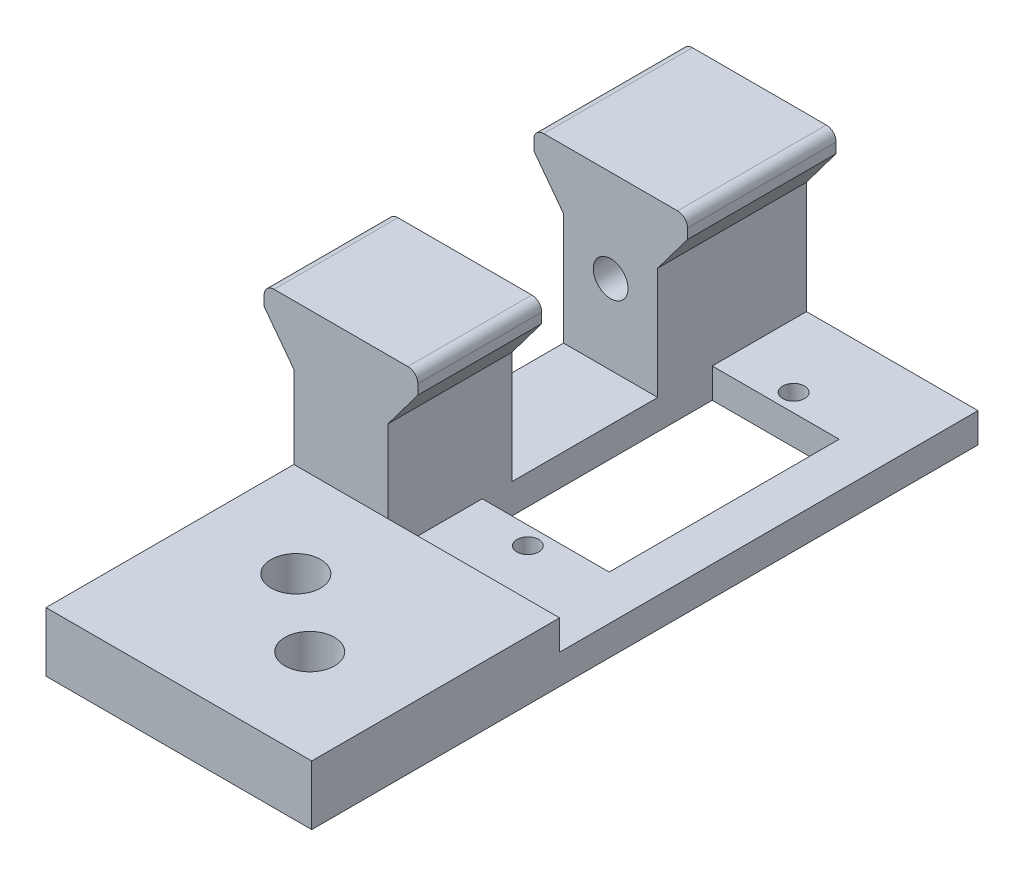
ISO-10303-21;
HEADER;
FILE_DESCRIPTION(('STEP AP214'),'2;1');
FILE_NAME('part.step','',(''),(''),'','','');
FILE_SCHEMA(('AUTOMOTIVE_DESIGN { 1 0 10303 214 1 1 1 1 }'));
ENDSEC;
DATA;
#1=APPLICATION_CONTEXT('core data for automotive mechanical design processes');
#2=APPLICATION_PROTOCOL_DEFINITION('international standard','automotive_design',2000,#1);
#3=PRODUCT_CONTEXT('',#1,'mechanical');
#4=PRODUCT('Part','Part','',(#3));
#5=PRODUCT_RELATED_PRODUCT_CATEGORY('part','',(#4));
#6=PRODUCT_DEFINITION_FORMATION('','',#4);
#7=PRODUCT_DEFINITION_CONTEXT('part definition',#1,'design');
#8=PRODUCT_DEFINITION('design','',#6,#7);
#9=PRODUCT_DEFINITION_SHAPE('','',#8);
#10=(LENGTH_UNIT() NAMED_UNIT(*) SI_UNIT(.MILLI.,.METRE.));
#11=(NAMED_UNIT(*) PLANE_ANGLE_UNIT() SI_UNIT($,.RADIAN.));
#12=(NAMED_UNIT(*) SI_UNIT($,.STERADIAN.) SOLID_ANGLE_UNIT());
#13=UNCERTAINTY_MEASURE_WITH_UNIT(LENGTH_MEASURE(1.E-05),#10,'distance_accuracy_value','');
#14=(GEOMETRIC_REPRESENTATION_CONTEXT(3) GLOBAL_UNCERTAINTY_ASSIGNED_CONTEXT((#13)) GLOBAL_UNIT_ASSIGNED_CONTEXT((#10,
#11,#12)) REPRESENTATION_CONTEXT('',''));
#15=CARTESIAN_POINT('',(0.,0.,0.));
#16=DIRECTION('',(0.,0.,1.));
#17=DIRECTION('',(1.,0.,0.));
#18=AXIS2_PLACEMENT_3D('',#15,#16,#17);
#19=CARTESIAN_POINT('',(-10.,3.,32.2));
#20=DIRECTION('',(0.,0.,-1.));
#21=DIRECTION('',(-1.,0.,0.));
#22=AXIS2_PLACEMENT_3D('',#19,#20,#21);
#23=PLANE('',#22);
#24=DIRECTION('',(-1.,0.,0.));
#25=VECTOR('',#24,1.);
#26=CARTESIAN_POINT('',(-10.,6.,32.2));
#27=LINE('',#26,#25);
#28=CARTESIAN_POINT('',(-0.500000000000092,6.,32.2));
#29=VERTEX_POINT('',#28);
#30=CARTESIAN_POINT('',(-10.,6.,32.2));
#31=VERTEX_POINT('',#30);
#32=EDGE_CURVE('E11',#29,#31,#27,.T.);
#33=ORIENTED_EDGE('',*,*,#32,.F.);
#34=DIRECTION('',(0.,-1.,0.));
#35=VECTOR('',#34,1.);
#36=CARTESIAN_POINT('',(-0.500000000000092,20.3,32.2));
#37=LINE('',#36,#35);
#38=CARTESIAN_POINT('',(-0.500000000000091,14.3,32.2));
#39=VERTEX_POINT('',#38);
#40=EDGE_CURVE('E360',#39,#29,#37,.T.);
#41=ORIENTED_EDGE('',*,*,#40,.F.);
#42=DIRECTION('',(0.6,0.8,0.));
#43=VECTOR('',#42,1.);
#44=CARTESIAN_POINT('',(2.49999999999991,18.3,32.2));
#45=LINE('',#44,#43);
#46=CARTESIAN_POINT('',(2.49999999999991,18.3,32.2));
#47=VERTEX_POINT('',#46);
#48=EDGE_CURVE('E300',#39,#47,#45,.T.);
#49=ORIENTED_EDGE('',*,*,#48,.T.);
#50=DIRECTION('',(0.,1.,0.));
#51=VECTOR('',#50,1.);
#52=CARTESIAN_POINT('',(2.49999999999991,20.3,32.2));
#53=LINE('',#52,#51);
#54=CARTESIAN_POINT('',(2.49999999999991,19.3,32.2));
#55=VERTEX_POINT('',#54);
#56=EDGE_CURVE('E311',#47,#55,#53,.T.);
#57=ORIENTED_EDGE('',*,*,#56,.T.);
#58=CARTESIAN_POINT('',(1.49999999999991,19.3,32.2));
#59=DIRECTION('',(0.,0.,-1.));
#60=DIRECTION('',(-1.,0.,0.));
#61=AXIS2_PLACEMENT_3D('',#58,#59,#60);
#62=CIRCLE('',#61,1.);
#63=CARTESIAN_POINT('',(1.49999999999991,20.3,32.2));
#64=VERTEX_POINT('',#63);
#65=EDGE_CURVE('E435',#55,#64,#62,.F.);
#66=ORIENTED_EDGE('',*,*,#65,.T.);
#67=DIRECTION('',(1.,0.,0.));
#68=VECTOR('',#67,1.);
#69=CARTESIAN_POINT('',(-10.,20.3,32.2));
#70=LINE('',#69,#68);
#71=CARTESIAN_POINT('',(-12.,20.3,32.2));
#72=VERTEX_POINT('',#71);
#73=EDGE_CURVE('E345',#72,#64,#70,.T.);
#74=ORIENTED_EDGE('',*,*,#73,.F.);
#75=CARTESIAN_POINT('',(-12.,19.3,32.2));
#76=DIRECTION('',(0.,0.,-1.));
#77=DIRECTION('',(-1.,0.,0.));
#78=AXIS2_PLACEMENT_3D('',#75,#76,#77);
#79=CIRCLE('',#78,1.);
#80=CARTESIAN_POINT('',(-13.,19.3,32.2));
#81=VERTEX_POINT('',#80);
#82=EDGE_CURVE('E437',#72,#81,#79,.F.);
#83=ORIENTED_EDGE('',*,*,#82,.T.);
#84=DIRECTION('',(0.,-1.,0.));
#85=VECTOR('',#84,1.);
#86=CARTESIAN_POINT('',(-13.,20.3,32.2));
#87=LINE('',#86,#85);
#88=CARTESIAN_POINT('',(-13.,18.3,32.2));
#89=VERTEX_POINT('',#88);
#90=EDGE_CURVE('E298',#81,#89,#87,.T.);
#91=ORIENTED_EDGE('',*,*,#90,.T.);
#92=DIRECTION('',(0.600000000000001,-0.8,0.));
#93=VECTOR('',#92,1.);
#94=CARTESIAN_POINT('',(-13.,18.3,32.2));
#95=LINE('',#94,#93);
#96=CARTESIAN_POINT('',(-10.,14.3,32.2));
#97=VERTEX_POINT('',#96);
#98=EDGE_CURVE('E289',#89,#97,#95,.T.);
#99=ORIENTED_EDGE('',*,*,#98,.T.);
#100=DIRECTION('',(0.,-1.,0.));
#101=VECTOR('',#100,1.);
#102=CARTESIAN_POINT('',(-10.,3.,32.2));
#103=LINE('',#102,#101);
#104=EDGE_CURVE('E423',#97,#31,#103,.T.);
#105=ORIENTED_EDGE('',*,*,#104,.T.);
#106=EDGE_LOOP('',(#33,#41,#49,#57,#66,#74,#83,#91,#99,#105));
#107=FACE_BOUND('',#106,.T.);
#108=ADVANCED_FACE('F39',(#107),#23,.F.);
#109=CARTESIAN_POINT('',(0.,20.3,0.));
#110=DIRECTION('',(0.,-1.,0.));
#111=DIRECTION('',(0.,0.,-1.));
#112=AXIS2_PLACEMENT_3D('',#109,#110,#111);
#113=PLANE('',#112);
#114=DIRECTION('',(-1.,0.,0.));
#115=VECTOR('',#114,1.);
#116=CARTESIAN_POINT('',(-10.,20.3,19.7));
#117=LINE('',#116,#115);
#118=CARTESIAN_POINT('',(1.49999999999991,20.3,19.7));
#119=VERTEX_POINT('',#118);
#120=CARTESIAN_POINT('',(-12.,20.3,19.7));
#121=VERTEX_POINT('',#120);
#122=EDGE_CURVE('E348',#119,#121,#117,.T.);
#123=ORIENTED_EDGE('',*,*,#122,.T.);
#124=DIRECTION('',(0.,0.,1.));
#125=VECTOR('',#124,1.);
#126=CARTESIAN_POINT('',(-12.,20.3,32.2));
#127=LINE('',#126,#125);
#128=EDGE_CURVE('E432',#121,#72,#127,.T.);
#129=ORIENTED_EDGE('',*,*,#128,.T.);
#130=ORIENTED_EDGE('',*,*,#73,.T.);
#131=DIRECTION('',(0.,0.,1.));
#132=VECTOR('',#131,1.);
#133=CARTESIAN_POINT('',(1.49999999999991,20.3,19.7));
#134=LINE('',#133,#132);
#135=EDGE_CURVE('E430',#64,#119,#134,.F.);
#136=ORIENTED_EDGE('',*,*,#135,.T.);
#137=EDGE_LOOP('',(#123,#129,#130,#136));
#138=FACE_BOUND('',#137,.T.);
#139=ADVANCED_FACE('F488',(#138),#113,.F.);
#140=CARTESIAN_POINT('',(2.49999999999991,20.3,-16.7082039324993));
#141=DIRECTION('',(1.,0.,0.));
#142=DIRECTION('',(0.,1.,0.));
#143=AXIS2_PLACEMENT_3D('',#140,#141,#142);
#144=PLANE('',#143);
#145=DIRECTION('',(0.,1.,0.));
#146=VECTOR('',#145,1.);
#147=CARTESIAN_POINT('',(2.49999999999991,-18.3621160000595,19.7));
#148=LINE('',#147,#146);
#149=CARTESIAN_POINT('',(2.49999999999991,18.3,19.7));
#150=VERTEX_POINT('',#149);
#151=CARTESIAN_POINT('',(2.49999999999991,19.3,19.7));
#152=VERTEX_POINT('',#151);
#153=EDGE_CURVE('E272',#150,#152,#148,.T.);
#154=ORIENTED_EDGE('',*,*,#153,.T.);
#155=DIRECTION('',(0.,0.,1.));
#156=VECTOR('',#155,1.);
#157=CARTESIAN_POINT('',(2.49999999999991,19.3,32.2));
#158=LINE('',#157,#156);
#159=EDGE_CURVE('E460',#152,#55,#158,.T.);
#160=ORIENTED_EDGE('',*,*,#159,.T.);
#161=ORIENTED_EDGE('',*,*,#56,.F.);
#162=DIRECTION('',(0.,0.,1.));
#163=VECTOR('',#162,1.);
#164=CARTESIAN_POINT('',(2.49999999999991,18.3,-16.7082039324993));
#165=LINE('',#164,#163);
#166=EDGE_CURVE('E317',#150,#47,#165,.T.);
#167=ORIENTED_EDGE('',*,*,#166,.F.);
#168=EDGE_LOOP('',(#154,#160,#161,#167));
#169=FACE_BOUND('',#168,.T.);
#170=ADVANCED_FACE('F465',(#169),#144,.T.);
#171=CARTESIAN_POINT('',(2.49999999999991,18.3,-16.7082039324993));
#172=DIRECTION('',(0.8,-0.6,0.));
#173=DIRECTION('',(0.6,0.8,0.));
#174=AXIS2_PLACEMENT_3D('',#171,#172,#173);
#175=PLANE('',#174);
#176=DIRECTION('',(-0.6,-0.8,0.));
#177=VECTOR('',#176,1.);
#178=CARTESIAN_POINT('',(2.49999999999991,18.3,19.7));
#179=LINE('',#178,#177);
#180=CARTESIAN_POINT('',(-0.50000000000009,14.3,19.7));
#181=VERTEX_POINT('',#180);
#182=EDGE_CURVE('E283',#150,#181,#179,.T.);
#183=ORIENTED_EDGE('',*,*,#182,.F.);
#184=ORIENTED_EDGE('',*,*,#166,.T.);
#185=ORIENTED_EDGE('',*,*,#48,.F.);
#186=DIRECTION('',(0.,0.,1.));
#187=VECTOR('',#186,1.);
#188=CARTESIAN_POINT('',(-0.500000000000091,14.3,-16.7082039324993));
#189=LINE('',#188,#187);
#190=EDGE_CURVE('E314',#181,#39,#189,.T.);
#191=ORIENTED_EDGE('',*,*,#190,.F.);
#192=EDGE_LOOP('',(#183,#184,#185,#191));
#193=FACE_BOUND('',#192,.T.);
#194=ADVANCED_FACE('F474',(#193),#175,.T.);
#195=CARTESIAN_POINT('',(-13.,18.3,-16.7082039324993));
#196=DIRECTION('',(-0.799999999999999,-0.600000000000001,0.));
#197=DIRECTION('',(0.600000000000001,-0.799999999999999,0.));
#198=AXIS2_PLACEMENT_3D('',#195,#196,#197);
#199=PLANE('',#198);
#200=DIRECTION('',(-0.600000000000001,0.799999999999999,0.));
#201=VECTOR('',#200,1.);
#202=CARTESIAN_POINT('',(-13.,18.3,19.7));
#203=LINE('',#202,#201);
#204=CARTESIAN_POINT('',(-10.,14.3,19.7));
#205=VERTEX_POINT('',#204);
#206=CARTESIAN_POINT('',(-13.,18.3,19.7));
#207=VERTEX_POINT('',#206);
#208=EDGE_CURVE('E281',#205,#207,#203,.T.);
#209=ORIENTED_EDGE('',*,*,#208,.F.);
#210=DIRECTION('',(0.,0.,1.));
#211=VECTOR('',#210,1.);
#212=CARTESIAN_POINT('',(-10.,14.3,-16.7082039324993));
#213=LINE('',#212,#211);
#214=EDGE_CURVE('E295',#205,#97,#213,.T.);
#215=ORIENTED_EDGE('',*,*,#214,.T.);
#216=ORIENTED_EDGE('',*,*,#98,.F.);
#217=DIRECTION('',(0.,0.,1.));
#218=VECTOR('',#217,1.);
#219=CARTESIAN_POINT('',(-13.,18.3,-16.7082039324993));
#220=LINE('',#219,#218);
#221=EDGE_CURVE('E290',#207,#89,#220,.T.);
#222=ORIENTED_EDGE('',*,*,#221,.F.);
#223=EDGE_LOOP('',(#209,#215,#216,#222));
#224=FACE_BOUND('',#223,.T.);
#225=ADVANCED_FACE('F502',(#224),#199,.T.);
#226=CARTESIAN_POINT('',(-13.,20.3,-16.7082039324993));
#227=DIRECTION('',(-1.,0.,0.));
#228=DIRECTION('',(0.,0.,1.));
#229=AXIS2_PLACEMENT_3D('',#226,#227,#228);
#230=PLANE('',#229);
#231=ORIENTED_EDGE('',*,*,#90,.F.);
#232=DIRECTION('',(0.,0.,1.));
#233=VECTOR('',#232,1.);
#234=CARTESIAN_POINT('',(-13.,19.3,19.7));
#235=LINE('',#234,#233);
#236=CARTESIAN_POINT('',(-13.,19.3,19.7));
#237=VERTEX_POINT('',#236);
#238=EDGE_CURVE('E439',#81,#237,#235,.F.);
#239=ORIENTED_EDGE('',*,*,#238,.T.);
#240=DIRECTION('',(0.,1.,0.));
#241=VECTOR('',#240,1.);
#242=CARTESIAN_POINT('',(-13.,20.3,19.7));
#243=LINE('',#242,#241);
#244=EDGE_CURVE('E427',#207,#237,#243,.T.);
#245=ORIENTED_EDGE('',*,*,#244,.F.);
#246=ORIENTED_EDGE('',*,*,#221,.T.);
#247=EDGE_LOOP('',(#231,#239,#245,#246));
#248=FACE_BOUND('',#247,.T.);
#249=ADVANCED_FACE('F495',(#248),#230,.T.);
#250=CARTESIAN_POINT('',(-10.,3.,-9.99999999999998));
#251=DIRECTION('',(1.,0.,0.));
#252=DIRECTION('',(0.,0.,-1.));
#253=AXIS2_PLACEMENT_3D('',#250,#251,#252);
#254=PLANE('',#253);
#255=CARTESIAN_POINT('',(-10.,14.3,-9.99999999999998));
#256=VERTEX_POINT('',#255);
#257=CARTESIAN_POINT('',(-10.,14.3,5.00000000000003));
#258=VERTEX_POINT('',#257);
#259=EDGE_CURVE('E291',#256,#258,#213,.T.);
#260=ORIENTED_EDGE('',*,*,#259,.F.);
#261=DIRECTION('',(0.,-1.,0.));
#262=VECTOR('',#261,1.);
#263=CARTESIAN_POINT('',(-10.,3.,-9.99999999999998));
#264=LINE('',#263,#262);
#265=CARTESIAN_POINT('',(-10.,0.,-9.99999999999998));
#266=VERTEX_POINT('',#265);
#267=EDGE_CURVE('E236',#256,#266,#264,.T.);
#268=ORIENTED_EDGE('',*,*,#267,.T.);
#269=DIRECTION('',(0.,0.,1.));
#270=VECTOR('',#269,1.);
#271=CARTESIAN_POINT('',(-10.,0.,-9.99999999999998));
#272=LINE('',#271,#270);
#273=CARTESIAN_POINT('',(-10.,0.,57.2));
#274=VERTEX_POINT('',#273);
#275=EDGE_CURVE('E229',#266,#274,#272,.T.);
#276=ORIENTED_EDGE('',*,*,#275,.T.);
#277=DIRECTION('',(0.,-1.,0.));
#278=VECTOR('',#277,1.);
#279=CARTESIAN_POINT('',(-10.,0.,57.2));
#280=LINE('',#279,#278);
#281=CARTESIAN_POINT('',(-10.,6.,57.2));
#282=VERTEX_POINT('',#281);
#283=EDGE_CURVE('E234',#282,#274,#280,.T.);
#284=ORIENTED_EDGE('',*,*,#283,.F.);
#285=DIRECTION('',(0.,0.,-1.));
#286=VECTOR('',#285,1.);
#287=CARTESIAN_POINT('',(-10.,6.,57.2));
#288=LINE('',#287,#286);
#289=EDGE_CURVE('E264',#282,#31,#288,.T.);
#290=ORIENTED_EDGE('',*,*,#289,.T.);
#291=ORIENTED_EDGE('',*,*,#104,.F.);
#292=ORIENTED_EDGE('',*,*,#214,.F.);
#293=DIRECTION('',(0.,-1.,0.));
#294=VECTOR('',#293,1.);
#295=CARTESIAN_POINT('',(-10.,20.3,19.7));
#296=LINE('',#295,#294);
#297=CARTESIAN_POINT('',(-10.,3.,19.7));
#298=VERTEX_POINT('',#297);
#299=EDGE_CURVE('E352',#205,#298,#296,.T.);
#300=ORIENTED_EDGE('',*,*,#299,.T.);
#301=DIRECTION('',(0.,0.,1.));
#302=VECTOR('',#301,1.);
#303=CARTESIAN_POINT('',(-10.,3.,-9.99999999999998));
#304=LINE('',#303,#302);
#305=CARTESIAN_POINT('',(-10.,3.,5.00000000000002));
#306=VERTEX_POINT('',#305);
#307=EDGE_CURVE('E406',#306,#298,#304,.T.);
#308=ORIENTED_EDGE('',*,*,#307,.F.);
#309=DIRECTION('',(0.,-1.,0.));
#310=VECTOR('',#309,1.);
#311=CARTESIAN_POINT('',(-10.,20.3,5.00000000000002));
#312=LINE('',#311,#310);
#313=EDGE_CURVE('E324',#258,#306,#312,.T.);
#314=ORIENTED_EDGE('',*,*,#313,.F.);
#315=EDGE_LOOP('',(#260,#268,#276,#284,#290,#291,#292,#300,#308,#314));
#316=FACE_BOUND('',#315,.T.);
#317=ADVANCED_FACE('F231',(#316),#254,.F.);
#318=CARTESIAN_POINT('',(0.,3.,0.));
#319=DIRECTION('',(0.,1.,0.));
#320=DIRECTION('',(0.,0.,1.));
#321=AXIS2_PLACEMENT_3D('',#318,#319,#320);
#322=PLANE('',#321);
#323=DIRECTION('',(0.,0.,1.));
#324=VECTOR('',#323,1.);
#325=CARTESIAN_POINT('',(-0.500000000000092,3.,22.7));
#326=LINE('',#325,#324);
#327=CARTESIAN_POINT('',(-0.500000000000092,3.,5.00000000000002));
#328=VERTEX_POINT('',#327);
#329=CARTESIAN_POINT('',(-0.500000000000092,3.,19.7));
#330=VERTEX_POINT('',#329);
#331=EDGE_CURVE('E363',#328,#330,#326,.T.);
#332=ORIENTED_EDGE('',*,*,#331,.F.);
#333=DIRECTION('',(1.,0.,0.));
#334=VECTOR('',#333,1.);
#335=CARTESIAN_POINT('',(-10.,3.,5.00000000000002));
#336=LINE('',#335,#334);
#337=EDGE_CURVE('E336',#306,#328,#336,.T.);
#338=ORIENTED_EDGE('',*,*,#337,.F.);
#339=ORIENTED_EDGE('',*,*,#307,.T.);
#340=DIRECTION('',(-1.,0.,0.));
#341=VECTOR('',#340,1.);
#342=CARTESIAN_POINT('',(-10.,3.,19.7));
#343=LINE('',#342,#341);
#344=EDGE_CURVE('E349',#330,#298,#343,.T.);
#345=ORIENTED_EDGE('',*,*,#344,.F.);
#346=EDGE_LOOP('',(#332,#338,#339,#345));
#347=FACE_BOUND('',#346,.T.);
#348=ADVANCED_FACE('F569',(#347),#322,.T.);
#349=CARTESIAN_POINT('',(5.89999999999991,3.,-2.29999999999998));
#350=DIRECTION('',(0.,1.,0.));
#351=DIRECTION('',(0.,0.,1.));
#352=AXIS2_PLACEMENT_3D('',#349,#350,#351);
#353=CIRCLE('',#352,1.1);
#354=CARTESIAN_POINT('',(5.89999999999991,3.,-1.19999999999998));
#355=VERTEX_POINT('',#354);
#356=EDGE_CURVE('E241',#355,#355,#353,.T.);
#357=ORIENTED_EDGE('',*,*,#356,.F.);
#358=EDGE_LOOP('',(#357));
#359=FACE_BOUND('',#358,.T.);
#360=CARTESIAN_POINT('',(5.89999999999991,3.,24.5));
#361=DIRECTION('',(0.,1.,0.));
#362=DIRECTION('',(0.,0.,1.));
#363=AXIS2_PLACEMENT_3D('',#360,#361,#362);
#364=CIRCLE('',#363,1.1);
#365=CARTESIAN_POINT('',(5.89999999999991,3.,25.6));
#366=VERTEX_POINT('',#365);
#367=EDGE_CURVE('E396',#366,#366,#364,.T.);
#368=ORIENTED_EDGE('',*,*,#367,.F.);
#369=EDGE_LOOP('',(#368));
#370=FACE_BOUND('',#369,.T.);
#371=DIRECTION('',(-1.,0.,0.));
#372=VECTOR('',#371,1.);
#373=CARTESIAN_POINT('',(-10.,3.,-9.99999999999998));
#374=LINE('',#373,#372);
#375=CARTESIAN_POINT('',(16.7999999999999,3.,-9.99999999999998));
#376=VERTEX_POINT('',#375);
#377=CARTESIAN_POINT('',(-0.500000000000092,3.,-9.99999999999998));
#378=VERTEX_POINT('',#377);
#379=EDGE_CURVE('E414',#376,#378,#374,.T.);
#380=ORIENTED_EDGE('',*,*,#379,.T.);
#381=DIRECTION('',(0.,0.,-1.));
#382=VECTOR('',#381,1.);
#383=CARTESIAN_POINT('',(-0.500000000000092,3.,-9.99999999999998));
#384=LINE('',#383,#382);
#385=CARTESIAN_POINT('',(-0.500000000000092,3.,-0.499999999999997));
#386=VERTEX_POINT('',#385);
#387=EDGE_CURVE('E333',#386,#378,#384,.T.);
#388=ORIENTED_EDGE('',*,*,#387,.F.);
#389=DIRECTION('',(-1.,0.,0.));
#390=VECTOR('',#389,1.);
#391=CARTESIAN_POINT('',(-0.500000000000092,3.,-0.5));
#392=LINE('',#391,#390);
#393=CARTESIAN_POINT('',(12.2999999999999,3.,-0.5));
#394=VERTEX_POINT('',#393);
#395=EDGE_CURVE('E372',#394,#386,#392,.T.);
#396=ORIENTED_EDGE('',*,*,#395,.F.);
#397=DIRECTION('',(0.,0.,-1.));
#398=VECTOR('',#397,1.);
#399=CARTESIAN_POINT('',(12.2999999999999,3.,22.7));
#400=LINE('',#399,#398);
#401=CARTESIAN_POINT('',(12.2999999999999,3.,22.7));
#402=VERTEX_POINT('',#401);
#403=EDGE_CURVE('E369',#402,#394,#400,.T.);
#404=ORIENTED_EDGE('',*,*,#403,.F.);
#405=DIRECTION('',(1.,0.,0.));
#406=VECTOR('',#405,1.);
#407=CARTESIAN_POINT('',(-0.500000000000092,3.,22.7));
#408=LINE('',#407,#406);
#409=CARTESIAN_POINT('',(-0.500000000000092,3.,22.7));
#410=VERTEX_POINT('',#409);
#411=EDGE_CURVE('E366',#410,#402,#408,.T.);
#412=ORIENTED_EDGE('',*,*,#411,.F.);
#413=DIRECTION('',(0.,0.,-1.));
#414=VECTOR('',#413,1.);
#415=CARTESIAN_POINT('',(-0.500000000000092,3.,32.2));
#416=LINE('',#415,#414);
#417=CARTESIAN_POINT('',(-0.500000000000092,3.,32.2));
#418=VERTEX_POINT('',#417);
#419=EDGE_CURVE('E340',#418,#410,#416,.T.);
#420=ORIENTED_EDGE('',*,*,#419,.F.);
#421=DIRECTION('',(1.,0.,0.));
#422=VECTOR('',#421,1.);
#423=CARTESIAN_POINT('',(-10.,3.,32.2));
#424=LINE('',#423,#422);
#425=CARTESIAN_POINT('',(16.7999999999999,3.,32.2));
#426=VERTEX_POINT('',#425);
#427=EDGE_CURVE('E409',#418,#426,#424,.T.);
#428=ORIENTED_EDGE('',*,*,#427,.T.);
#429=DIRECTION('',(0.,0.,-1.));
#430=VECTOR('',#429,1.);
#431=CARTESIAN_POINT('',(16.7999999999999,3.,-9.99999999999998));
#432=LINE('',#431,#430);
#433=EDGE_CURVE('E412',#426,#376,#432,.T.);
#434=ORIENTED_EDGE('',*,*,#433,.T.);
#435=EDGE_LOOP('',(#380,#388,#396,#404,#412,#420,#428,#434));
#436=FACE_BOUND('',#435,.T.);
#437=ADVANCED_FACE('F517',(#359,#370,#436),#322,.T.);
#438=CARTESIAN_POINT('',(0.,0.,0.));
#439=DIRECTION('',(0.,1.,0.));
#440=DIRECTION('',(0.,0.,1.));
#441=AXIS2_PLACEMENT_3D('',#438,#439,#440);
#442=PLANE('',#441);
#443=CARTESIAN_POINT('',(-0.350000000000049,0.,41.65));
#444=DIRECTION('',(0.,1.,0.));
#445=DIRECTION('',(0.,0.,1.));
#446=AXIS2_PLACEMENT_3D('',#443,#444,#445);
#447=CIRCLE('',#446,1.1);
#448=CARTESIAN_POINT('',(-0.350000000000049,0.,42.75));
#449=VERTEX_POINT('',#448);
#450=EDGE_CURVE('E664',#449,#449,#447,.T.);
#451=ORIENTED_EDGE('',*,*,#450,.T.);
#452=EDGE_LOOP('',(#451));
#453=FACE_BOUND('',#452,.T.);
#454=CARTESIAN_POINT('',(7.14999999999995,0.,47.75));
#455=DIRECTION('',(0.,1.,0.));
#456=DIRECTION('',(0.,0.,1.));
#457=AXIS2_PLACEMENT_3D('',#454,#455,#456);
#458=CIRCLE('',#457,1.1);
#459=CARTESIAN_POINT('',(7.14999999999995,0.,48.85));
#460=VERTEX_POINT('',#459);
#461=EDGE_CURVE('E668',#460,#460,#458,.T.);
#462=ORIENTED_EDGE('',*,*,#461,.T.);
#463=EDGE_LOOP('',(#462));
#464=FACE_BOUND('',#463,.T.);
#465=CARTESIAN_POINT('',(5.89999999999991,0.,24.5));
#466=DIRECTION('',(0.,1.,0.));
#467=DIRECTION('',(0.,0.,1.));
#468=AXIS2_PLACEMENT_3D('',#465,#466,#467);
#469=CIRCLE('',#468,1.1);
#470=CARTESIAN_POINT('',(5.89999999999991,0.,25.6));
#471=VERTEX_POINT('',#470);
#472=EDGE_CURVE('E395',#471,#471,#469,.T.);
#473=ORIENTED_EDGE('',*,*,#472,.T.);
#474=EDGE_LOOP('',(#473));
#475=FACE_BOUND('',#474,.T.);
#476=CARTESIAN_POINT('',(5.89999999999991,0.,-2.29999999999998));
#477=DIRECTION('',(0.,1.,0.));
#478=DIRECTION('',(0.,0.,1.));
#479=AXIS2_PLACEMENT_3D('',#476,#477,#478);
#480=CIRCLE('',#479,1.1);
#481=CARTESIAN_POINT('',(5.89999999999991,0.,-1.19999999999998));
#482=VERTEX_POINT('',#481);
#483=EDGE_CURVE('E399',#482,#482,#480,.T.);
#484=ORIENTED_EDGE('',*,*,#483,.T.);
#485=EDGE_LOOP('',(#484));
#486=FACE_BOUND('',#485,.T.);
#487=ORIENTED_EDGE('',*,*,#275,.F.);
#488=DIRECTION('',(-1.,0.,0.));
#489=VECTOR('',#488,1.);
#490=CARTESIAN_POINT('',(-10.,0.,-9.99999999999998));
#491=LINE('',#490,#489);
#492=CARTESIAN_POINT('',(16.7999999999999,0.,-9.99999999999998));
#493=VERTEX_POINT('',#492);
#494=EDGE_CURVE('E410',#493,#266,#491,.T.);
#495=ORIENTED_EDGE('',*,*,#494,.F.);
#496=DIRECTION('',(0.,0.,-1.));
#497=VECTOR('',#496,1.);
#498=CARTESIAN_POINT('',(16.7999999999999,0.,-9.99999999999998));
#499=LINE('',#498,#497);
#500=CARTESIAN_POINT('',(16.7999999999999,0.,57.2));
#501=VERTEX_POINT('',#500);
#502=EDGE_CURVE('E240',#501,#493,#499,.T.);
#503=ORIENTED_EDGE('',*,*,#502,.F.);
#504=DIRECTION('',(1.,0.,0.));
#505=VECTOR('',#504,1.);
#506=CARTESIAN_POINT('',(-10.,0.,57.2));
#507=LINE('',#506,#505);
#508=EDGE_CURVE('E244',#274,#501,#507,.T.);
#509=ORIENTED_EDGE('',*,*,#508,.F.);
#510=EDGE_LOOP('',(#487,#495,#503,#509));
#511=FACE_BOUND('',#510,.T.);
#512=DIRECTION('',(0.,0.,1.));
#513=VECTOR('',#512,1.);
#514=CARTESIAN_POINT('',(-0.500000000000092,0.,22.7));
#515=LINE('',#514,#513);
#516=CARTESIAN_POINT('',(-0.500000000000092,0.,-0.5));
#517=VERTEX_POINT('',#516);
#518=CARTESIAN_POINT('',(-0.500000000000092,0.,22.7));
#519=VERTEX_POINT('',#518);
#520=EDGE_CURVE('E362',#517,#519,#515,.T.);
#521=ORIENTED_EDGE('',*,*,#520,.T.);
#522=DIRECTION('',(1.,0.,0.));
#523=VECTOR('',#522,1.);
#524=CARTESIAN_POINT('',(-0.500000000000092,0.,22.7));
#525=LINE('',#524,#523);
#526=CARTESIAN_POINT('',(12.2999999999999,0.,22.7));
#527=VERTEX_POINT('',#526);
#528=EDGE_CURVE('E378',#519,#527,#525,.T.);
#529=ORIENTED_EDGE('',*,*,#528,.T.);
#530=DIRECTION('',(0.,0.,-1.));
#531=VECTOR('',#530,1.);
#532=CARTESIAN_POINT('',(12.2999999999999,0.,22.7));
#533=LINE('',#532,#531);
#534=CARTESIAN_POINT('',(12.2999999999999,0.,-0.5));
#535=VERTEX_POINT('',#534);
#536=EDGE_CURVE('E381',#527,#535,#533,.T.);
#537=ORIENTED_EDGE('',*,*,#536,.T.);
#538=DIRECTION('',(-1.,0.,0.));
#539=VECTOR('',#538,1.);
#540=CARTESIAN_POINT('',(-0.500000000000092,0.,-0.5));
#541=LINE('',#540,#539);
#542=EDGE_CURVE('E367',#535,#517,#541,.T.);
#543=ORIENTED_EDGE('',*,*,#542,.T.);
#544=EDGE_LOOP('',(#521,#529,#537,#543));
#545=FACE_BOUND('',#544,.T.);
#546=ADVANCED_FACE('F245',(#453,#464,#475,#486,#511,#545),#442,.F.);
#547=CARTESIAN_POINT('',(16.7999999999999,3.,-9.99999999999998));
#548=DIRECTION('',(-1.,0.,0.));
#549=DIRECTION('',(0.,0.,1.));
#550=AXIS2_PLACEMENT_3D('',#547,#548,#549);
#551=PLANE('',#550);
#552=ORIENTED_EDGE('',*,*,#502,.T.);
#553=DIRECTION('',(0.,-1.,0.));
#554=VECTOR('',#553,1.);
#555=CARTESIAN_POINT('',(16.7999999999999,3.,-9.99999999999998));
#556=LINE('',#555,#554);
#557=EDGE_CURVE('E420',#376,#493,#556,.T.);
#558=ORIENTED_EDGE('',*,*,#557,.F.);
#559=ORIENTED_EDGE('',*,*,#433,.F.);
#560=DIRECTION('',(0.,1.,0.));
#561=VECTOR('',#560,1.);
#562=CARTESIAN_POINT('',(16.7999999999999,0.,32.2));
#563=LINE('',#562,#561);
#564=CARTESIAN_POINT('',(16.7999999999999,6.,32.2));
#565=VERTEX_POINT('',#564);
#566=EDGE_CURVE('E257',#426,#565,#563,.T.);
#567=ORIENTED_EDGE('',*,*,#566,.T.);
#568=DIRECTION('',(0.,0.,-1.));
#569=VECTOR('',#568,1.);
#570=CARTESIAN_POINT('',(16.7999999999999,6.,57.2));
#571=LINE('',#570,#569);
#572=CARTESIAN_POINT('',(16.7999999999999,6.,57.2));
#573=VERTEX_POINT('',#572);
#574=EDGE_CURVE('E268',#573,#565,#571,.T.);
#575=ORIENTED_EDGE('',*,*,#574,.F.);
#576=DIRECTION('',(0.,1.,0.));
#577=VECTOR('',#576,1.);
#578=CARTESIAN_POINT('',(16.7999999999999,0.,57.2));
#579=LINE('',#578,#577);
#580=EDGE_CURVE('E249',#501,#573,#579,.T.);
#581=ORIENTED_EDGE('',*,*,#580,.F.);
#582=EDGE_LOOP('',(#552,#558,#559,#567,#575,#581));
#583=FACE_BOUND('',#582,.T.);
#584=ADVANCED_FACE('F590',(#583),#551,.F.);
#585=CARTESIAN_POINT('',(-10.,3.,-9.99999999999998));
#586=DIRECTION('',(0.,0.,1.));
#587=DIRECTION('',(1.,0.,0.));
#588=AXIS2_PLACEMENT_3D('',#585,#586,#587);
#589=PLANE('',#588);
#590=DIRECTION('',(-1.,0.,0.));
#591=VECTOR('',#590,1.);
#592=CARTESIAN_POINT('',(-10.,20.3,-9.99999999999998));
#593=LINE('',#592,#591);
#594=CARTESIAN_POINT('',(1.49999999999991,20.3,-9.99999999999998));
#595=VERTEX_POINT('',#594);
#596=CARTESIAN_POINT('',(-12.,20.3,-9.99999999999998));
#597=VERTEX_POINT('',#596);
#598=EDGE_CURVE('E332',#595,#597,#593,.T.);
#599=ORIENTED_EDGE('',*,*,#598,.F.);
#600=CARTESIAN_POINT('',(1.49999999999991,19.3,-9.99999999999998));
#601=DIRECTION('',(0.,0.,1.));
#602=DIRECTION('',(1.,0.,0.));
#603=AXIS2_PLACEMENT_3D('',#600,#601,#602);
#604=CIRCLE('',#603,1.);
#605=CARTESIAN_POINT('',(2.49999999999991,19.3,-9.99999999999998));
#606=VERTEX_POINT('',#605);
#607=EDGE_CURVE('E459',#595,#606,#604,.F.);
#608=ORIENTED_EDGE('',*,*,#607,.T.);
#609=DIRECTION('',(0.,-1.,0.));
#610=VECTOR('',#609,1.);
#611=CARTESIAN_POINT('',(2.49999999999991,20.3,-9.99999999999998));
#612=LINE('',#611,#610);
#613=CARTESIAN_POINT('',(2.49999999999991,18.3,-9.99999999999998));
#614=VERTEX_POINT('',#613);
#615=EDGE_CURVE('E305',#606,#614,#612,.T.);
#616=ORIENTED_EDGE('',*,*,#615,.T.);
#617=DIRECTION('',(-0.6,-0.8,0.));
#618=VECTOR('',#617,1.);
#619=CARTESIAN_POINT('',(2.49999999999991,18.3,-9.99999999999998));
#620=LINE('',#619,#618);
#621=CARTESIAN_POINT('',(-0.500000000000091,14.3,-9.99999999999998));
#622=VERTEX_POINT('',#621);
#623=EDGE_CURVE('E303',#614,#622,#620,.T.);
#624=ORIENTED_EDGE('',*,*,#623,.T.);
#625=DIRECTION('',(0.,-1.,0.));
#626=VECTOR('',#625,1.);
#627=CARTESIAN_POINT('',(-0.500000000000092,20.3,-9.99999999999998));
#628=LINE('',#627,#626);
#629=EDGE_CURVE('E330',#622,#378,#628,.T.);
#630=ORIENTED_EDGE('',*,*,#629,.T.);
#631=ORIENTED_EDGE('',*,*,#379,.F.);
#632=ORIENTED_EDGE('',*,*,#557,.T.);
#633=ORIENTED_EDGE('',*,*,#494,.T.);
#634=ORIENTED_EDGE('',*,*,#267,.F.);
#635=DIRECTION('',(-0.600000000000001,0.799999999999999,0.));
#636=VECTOR('',#635,1.);
#637=CARTESIAN_POINT('',(-13.,18.3,-9.99999999999998));
#638=LINE('',#637,#636);
#639=CARTESIAN_POINT('',(-13.,18.3,-9.99999999999998));
#640=VERTEX_POINT('',#639);
#641=EDGE_CURVE('E285',#256,#640,#638,.T.);
#642=ORIENTED_EDGE('',*,*,#641,.T.);
#643=DIRECTION('',(0.,1.,0.));
#644=VECTOR('',#643,1.);
#645=CARTESIAN_POINT('',(-13.,20.3,-9.99999999999998));
#646=LINE('',#645,#644);
#647=CARTESIAN_POINT('',(-13.,19.3,-9.99999999999998));
#648=VERTEX_POINT('',#647);
#649=EDGE_CURVE('E294',#640,#648,#646,.T.);
#650=ORIENTED_EDGE('',*,*,#649,.T.);
#651=CARTESIAN_POINT('',(-12.,19.3,-9.99999999999998));
#652=DIRECTION('',(0.,0.,1.));
#653=DIRECTION('',(1.,0.,0.));
#654=AXIS2_PLACEMENT_3D('',#651,#652,#653);
#655=CIRCLE('',#654,1.);
#656=EDGE_CURVE('E457',#648,#597,#655,.F.);
#657=ORIENTED_EDGE('',*,*,#656,.T.);
#658=EDGE_LOOP('',(#599,#608,#616,#624,#630,#631,#632,#633,#634,#642,#650,#657));
#659=FACE_BOUND('',#658,.T.);
#660=ADVANCED_FACE('F537',(#659),#589,.F.);
#661=CARTESIAN_POINT('',(5.89999999999991,3.,-2.29999999999998));
#662=DIRECTION('',(0.,-1.,0.));
#663=DIRECTION('',(0.,0.,-1.));
#664=AXIS2_PLACEMENT_3D('',#661,#662,#663);
#665=CYLINDRICAL_SURFACE('',#664,1.1);
#666=ORIENTED_EDGE('',*,*,#356,.T.);
#667=EDGE_LOOP('',(#666));
#668=FACE_BOUND('',#667,.T.);
#669=ORIENTED_EDGE('',*,*,#483,.F.);
#670=EDGE_LOOP('',(#669));
#671=FACE_BOUND('',#670,.T.);
#672=ADVANCED_FACE('F642',(#668,#671),#665,.F.);
#673=CARTESIAN_POINT('',(5.89999999999991,3.,24.5));
#674=DIRECTION('',(0.,-1.,0.));
#675=DIRECTION('',(0.,0.,-1.));
#676=AXIS2_PLACEMENT_3D('',#673,#674,#675);
#677=CYLINDRICAL_SURFACE('',#676,1.1);
#678=ORIENTED_EDGE('',*,*,#367,.T.);
#679=EDGE_LOOP('',(#678));
#680=FACE_BOUND('',#679,.T.);
#681=ORIENTED_EDGE('',*,*,#472,.F.);
#682=EDGE_LOOP('',(#681));
#683=FACE_BOUND('',#682,.T.);
#684=ADVANCED_FACE('F640',(#680,#683),#677,.F.);
#685=CARTESIAN_POINT('',(-0.500000000000092,3.,22.7));
#686=DIRECTION('',(1.,0.,0.));
#687=DIRECTION('',(0.,0.,-1.));
#688=AXIS2_PLACEMENT_3D('',#685,#686,#687);
#689=PLANE('',#688);
#690=ORIENTED_EDGE('',*,*,#190,.T.);
#691=ORIENTED_EDGE('',*,*,#40,.T.);
#692=EDGE_CURVE('E359',#29,#418,#37,.T.);
#693=ORIENTED_EDGE('',*,*,#692,.T.);
#694=ORIENTED_EDGE('',*,*,#419,.T.);
#695=DIRECTION('',(0.,-1.,0.));
#696=VECTOR('',#695,1.);
#697=CARTESIAN_POINT('',(-0.500000000000092,3.,22.7));
#698=LINE('',#697,#696);
#699=EDGE_CURVE('E392',#410,#519,#698,.T.);
#700=ORIENTED_EDGE('',*,*,#699,.T.);
#701=ORIENTED_EDGE('',*,*,#520,.F.);
#702=DIRECTION('',(0.,-1.,0.));
#703=VECTOR('',#702,1.);
#704=CARTESIAN_POINT('',(-0.500000000000092,3.,-0.5));
#705=LINE('',#704,#703);
#706=EDGE_CURVE('E375',#386,#517,#705,.T.);
#707=ORIENTED_EDGE('',*,*,#706,.F.);
#708=ORIENTED_EDGE('',*,*,#387,.T.);
#709=ORIENTED_EDGE('',*,*,#629,.F.);
#710=CARTESIAN_POINT('',(-0.500000000000091,14.3,5.00000000000002));
#711=VERTEX_POINT('',#710);
#712=EDGE_CURVE('E318',#622,#711,#189,.T.);
#713=ORIENTED_EDGE('',*,*,#712,.T.);
#714=DIRECTION('',(0.,-1.,0.));
#715=VECTOR('',#714,1.);
#716=CARTESIAN_POINT('',(-0.500000000000092,20.3,5.00000000000002));
#717=LINE('',#716,#715);
#718=EDGE_CURVE('E328',#711,#328,#717,.T.);
#719=ORIENTED_EDGE('',*,*,#718,.T.);
#720=ORIENTED_EDGE('',*,*,#331,.T.);
#721=DIRECTION('',(0.,-1.,0.));
#722=VECTOR('',#721,1.);
#723=CARTESIAN_POINT('',(-0.500000000000092,20.3,19.7));
#724=LINE('',#723,#722);
#725=EDGE_CURVE('E357',#181,#330,#724,.T.);
#726=ORIENTED_EDGE('',*,*,#725,.F.);
#727=EDGE_LOOP('',(#690,#691,#693,#694,#700,#701,#707,#708,#709,#713,#719,#720,#726));
#728=FACE_BOUND('',#727,.T.);
#729=ADVANCED_FACE('F477',(#728),#689,.T.);
#730=CARTESIAN_POINT('',(-0.500000000000092,3.,22.7));
#731=DIRECTION('',(0.,0.,-1.));
#732=DIRECTION('',(-1.,0.,0.));
#733=AXIS2_PLACEMENT_3D('',#730,#731,#732);
#734=PLANE('',#733);
#735=ORIENTED_EDGE('',*,*,#528,.F.);
#736=ORIENTED_EDGE('',*,*,#699,.F.);
#737=ORIENTED_EDGE('',*,*,#411,.T.);
#738=DIRECTION('',(0.,-1.,0.));
#739=VECTOR('',#738,1.);
#740=CARTESIAN_POINT('',(12.2999999999999,3.,22.7));
#741=LINE('',#740,#739);
#742=EDGE_CURVE('E390',#402,#527,#741,.T.);
#743=ORIENTED_EDGE('',*,*,#742,.T.);
#744=EDGE_LOOP('',(#735,#736,#737,#743));
#745=FACE_BOUND('',#744,.T.);
#746=ADVANCED_FACE('F523',(#745),#734,.T.);
#747=CARTESIAN_POINT('',(12.2999999999999,3.,22.7));
#748=DIRECTION('',(-1.,0.,0.));
#749=DIRECTION('',(0.,0.,1.));
#750=AXIS2_PLACEMENT_3D('',#747,#748,#749);
#751=PLANE('',#750);
#752=ORIENTED_EDGE('',*,*,#536,.F.);
#753=ORIENTED_EDGE('',*,*,#742,.F.);
#754=ORIENTED_EDGE('',*,*,#403,.T.);
#755=DIRECTION('',(0.,-1.,0.));
#756=VECTOR('',#755,1.);
#757=CARTESIAN_POINT('',(12.2999999999999,3.,-0.5));
#758=LINE('',#757,#756);
#759=EDGE_CURVE('E388',#394,#535,#758,.T.);
#760=ORIENTED_EDGE('',*,*,#759,.T.);
#761=EDGE_LOOP('',(#752,#753,#754,#760));
#762=FACE_BOUND('',#761,.T.);
#763=ADVANCED_FACE('F526',(#762),#751,.T.);
#764=CARTESIAN_POINT('',(-0.500000000000092,3.,-0.5));
#765=DIRECTION('',(0.,0.,1.));
#766=DIRECTION('',(1.,0.,0.));
#767=AXIS2_PLACEMENT_3D('',#764,#765,#766);
#768=PLANE('',#767);
#769=ORIENTED_EDGE('',*,*,#542,.F.);
#770=ORIENTED_EDGE('',*,*,#759,.F.);
#771=ORIENTED_EDGE('',*,*,#395,.T.);
#772=ORIENTED_EDGE('',*,*,#706,.T.);
#773=EDGE_LOOP('',(#769,#770,#771,#772));
#774=FACE_BOUND('',#773,.T.);
#775=ADVANCED_FACE('F530',(#774),#768,.T.);
#776=CARTESIAN_POINT('',(-10.,20.3,19.7));
#777=DIRECTION('',(0.,0.,1.));
#778=DIRECTION('',(1.,0.,0.));
#779=AXIS2_PLACEMENT_3D('',#776,#777,#778);
#780=PLANE('',#779);
#781=ORIENTED_EDGE('',*,*,#244,.T.);
#782=CARTESIAN_POINT('',(-12.,19.3,19.7));
#783=DIRECTION('',(0.,0.,1.));
#784=DIRECTION('',(1.,0.,0.));
#785=AXIS2_PLACEMENT_3D('',#782,#783,#784);
#786=CIRCLE('',#785,1.);
#787=EDGE_CURVE('E443',#237,#121,#786,.F.);
#788=ORIENTED_EDGE('',*,*,#787,.T.);
#789=ORIENTED_EDGE('',*,*,#122,.F.);
#790=CARTESIAN_POINT('',(1.49999999999991,19.3,19.7));
#791=DIRECTION('',(0.,0.,1.));
#792=DIRECTION('',(1.,0.,0.));
#793=AXIS2_PLACEMENT_3D('',#790,#791,#792);
#794=CIRCLE('',#793,1.);
#795=EDGE_CURVE('E441',#119,#152,#794,.F.);
#796=ORIENTED_EDGE('',*,*,#795,.T.);
#797=ORIENTED_EDGE('',*,*,#153,.F.);
#798=ORIENTED_EDGE('',*,*,#182,.T.);
#799=ORIENTED_EDGE('',*,*,#725,.T.);
#800=ORIENTED_EDGE('',*,*,#344,.T.);
#801=ORIENTED_EDGE('',*,*,#299,.F.);
#802=ORIENTED_EDGE('',*,*,#208,.T.);
#803=EDGE_LOOP('',(#781,#788,#789,#796,#797,#798,#799,#800,#801,#802));
#804=FACE_BOUND('',#803,.T.);
#805=ADVANCED_FACE('F482',(#804),#780,.F.);
#806=DIRECTION('',(1.,0.,0.));
#807=VECTOR('',#806,1.);
#808=CARTESIAN_POINT('',(-10.,20.3,5.00000000000002));
#809=LINE('',#808,#807);
#810=CARTESIAN_POINT('',(-12.,20.3,5.00000000000002));
#811=VERTEX_POINT('',#810);
#812=CARTESIAN_POINT('',(1.49999999999991,20.3,5.00000000000002));
#813=VERTEX_POINT('',#812);
#814=EDGE_CURVE('E337',#811,#813,#809,.T.);
#815=ORIENTED_EDGE('',*,*,#814,.T.);
#816=DIRECTION('',(0.,0.,1.));
#817=VECTOR('',#816,1.);
#818=CARTESIAN_POINT('',(1.49999999999991,20.3,-9.99999999999998));
#819=LINE('',#818,#817);
#820=EDGE_CURVE('E455',#813,#595,#819,.F.);
#821=ORIENTED_EDGE('',*,*,#820,.T.);
#822=ORIENTED_EDGE('',*,*,#598,.T.);
#823=DIRECTION('',(0.,0.,1.));
#824=VECTOR('',#823,1.);
#825=CARTESIAN_POINT('',(-12.,20.3,5.00000000000002));
#826=LINE('',#825,#824);
#827=EDGE_CURVE('E452',#597,#811,#826,.T.);
#828=ORIENTED_EDGE('',*,*,#827,.T.);
#829=EDGE_LOOP('',(#815,#821,#822,#828));
#830=FACE_BOUND('',#829,.T.);
#831=ADVANCED_FACE('F555',(#830),#113,.F.);
#832=CARTESIAN_POINT('',(-10.,20.3,5.00000000000002));
#833=DIRECTION('',(0.,0.,-1.));
#834=DIRECTION('',(-1.,0.,0.));
#835=AXIS2_PLACEMENT_3D('',#832,#833,#834);
#836=PLANE('',#835);
#837=CARTESIAN_POINT('',(-5.25000000000005,11.,5.00000000000002));
#838=DIRECTION('',(0.,0.,1.));
#839=DIRECTION('',(1.,0.,0.));
#840=AXIS2_PLACEMENT_3D('',#837,#838,#839);
#841=CIRCLE('',#840,1.75);
#842=CARTESIAN_POINT('',(-3.50000000000005,11.,5.00000000000002));
#843=VERTEX_POINT('',#842);
#844=EDGE_CURVE('E308',#843,#843,#841,.T.);
#845=ORIENTED_EDGE('',*,*,#844,.F.);
#846=EDGE_LOOP('',(#845));
#847=FACE_BOUND('',#846,.T.);
#848=DIRECTION('',(0.,1.,0.));
#849=VECTOR('',#848,1.);
#850=CARTESIAN_POINT('',(2.49999999999991,-18.3621160000595,5.00000000000002));
#851=LINE('',#850,#849);
#852=CARTESIAN_POINT('',(2.4999999999999,18.3,5.00000000000002));
#853=VERTEX_POINT('',#852);
#854=CARTESIAN_POINT('',(2.49999999999991,19.3,5.00000000000002));
#855=VERTEX_POINT('',#854);
#856=EDGE_CURVE('E271',#853,#855,#851,.T.);
#857=ORIENTED_EDGE('',*,*,#856,.T.);
#858=CARTESIAN_POINT('',(1.49999999999991,19.3,5.00000000000002));
#859=DIRECTION('',(0.,0.,-1.));
#860=DIRECTION('',(-1.,0.,0.));
#861=AXIS2_PLACEMENT_3D('',#858,#859,#860);
#862=CIRCLE('',#861,1.);
#863=EDGE_CURVE('E450',#855,#813,#862,.F.);
#864=ORIENTED_EDGE('',*,*,#863,.T.);
#865=ORIENTED_EDGE('',*,*,#814,.F.);
#866=CARTESIAN_POINT('',(-12.,19.3,5.00000000000002));
#867=DIRECTION('',(0.,0.,-1.));
#868=DIRECTION('',(-1.,0.,0.));
#869=AXIS2_PLACEMENT_3D('',#866,#867,#868);
#870=CIRCLE('',#869,1.);
#871=CARTESIAN_POINT('',(-13.,19.3,5.00000000000003));
#872=VERTEX_POINT('',#871);
#873=EDGE_CURVE('E448',#811,#872,#870,.F.);
#874=ORIENTED_EDGE('',*,*,#873,.T.);
#875=DIRECTION('',(0.,-1.,0.));
#876=VECTOR('',#875,1.);
#877=CARTESIAN_POINT('',(-13.,20.3,5.00000000000003));
#878=LINE('',#877,#876);
#879=CARTESIAN_POINT('',(-13.,18.3,5.00000000000002));
#880=VERTEX_POINT('',#879);
#881=EDGE_CURVE('E425',#872,#880,#878,.T.);
#882=ORIENTED_EDGE('',*,*,#881,.T.);
#883=DIRECTION('',(0.600000000000001,-0.799999999999999,0.));
#884=VECTOR('',#883,1.);
#885=CARTESIAN_POINT('',(-13.,18.3,5.00000000000003));
#886=LINE('',#885,#884);
#887=EDGE_CURVE('E275',#880,#258,#886,.T.);
#888=ORIENTED_EDGE('',*,*,#887,.T.);
#889=ORIENTED_EDGE('',*,*,#313,.T.);
#890=ORIENTED_EDGE('',*,*,#337,.T.);
#891=ORIENTED_EDGE('',*,*,#718,.F.);
#892=DIRECTION('',(0.6,0.8,0.));
#893=VECTOR('',#892,1.);
#894=CARTESIAN_POINT('',(2.49999999999991,18.3,5.00000000000002));
#895=LINE('',#894,#893);
#896=EDGE_CURVE('E279',#711,#853,#895,.T.);
#897=ORIENTED_EDGE('',*,*,#896,.T.);
#898=EDGE_LOOP('',(#857,#864,#865,#874,#882,#888,#889,#890,#891,#897));
#899=FACE_BOUND('',#898,.T.);
#900=ADVANCED_FACE('F545',(#847,#899),#836,.F.);
#901=CARTESIAN_POINT('',(-5.25000000000005,11.,-4.99999999999998));
#902=DIRECTION('',(0.,0.,1.));
#903=DIRECTION('',(1.,0.,0.));
#904=AXIS2_PLACEMENT_3D('',#901,#902,#903);
#905=CYLINDRICAL_SURFACE('',#904,1.75);
#906=CARTESIAN_POINT('',(-5.25000000000005,11.,-4.99999999999998));
#907=DIRECTION('',(0.,0.,1.));
#908=DIRECTION('',(1.,0.,0.));
#909=AXIS2_PLACEMENT_3D('',#906,#907,#908);
#910=CIRCLE('',#909,1.75);
#911=CARTESIAN_POINT('',(-3.50000000000005,11.,-4.99999999999998));
#912=VERTEX_POINT('',#911);
#913=EDGE_CURVE('E321',#912,#912,#910,.T.);
#914=ORIENTED_EDGE('',*,*,#913,.F.);
#915=EDGE_LOOP('',(#914));
#916=FACE_BOUND('',#915,.T.);
#917=ORIENTED_EDGE('',*,*,#844,.T.);
#918=EDGE_LOOP('',(#917));
#919=FACE_BOUND('',#918,.T.);
#920=ADVANCED_FACE('F624',(#916,#919),#905,.F.);
#921=CARTESIAN_POINT('',(-5.25000000000005,11.,-4.99999999999998));
#922=DIRECTION('',(0.,0.,1.));
#923=DIRECTION('',(1.,0.,0.));
#924=AXIS2_PLACEMENT_3D('',#921,#922,#923);
#925=PLANE('',#924);
#926=ORIENTED_EDGE('',*,*,#913,.T.);
#927=EDGE_LOOP('',(#926));
#928=FACE_BOUND('',#927,.T.);
#929=ADVANCED_FACE('F619',(#928),#925,.T.);
#930=ORIENTED_EDGE('',*,*,#615,.F.);
#931=DIRECTION('',(0.,0.,1.));
#932=VECTOR('',#931,1.);
#933=CARTESIAN_POINT('',(2.49999999999991,19.3,5.00000000000002));
#934=LINE('',#933,#932);
#935=EDGE_CURVE('E445',#606,#855,#934,.T.);
#936=ORIENTED_EDGE('',*,*,#935,.T.);
#937=ORIENTED_EDGE('',*,*,#856,.F.);
#938=EDGE_CURVE('E306',#614,#853,#165,.T.);
#939=ORIENTED_EDGE('',*,*,#938,.F.);
#940=EDGE_LOOP('',(#930,#936,#937,#939));
#941=FACE_BOUND('',#940,.T.);
#942=ADVANCED_FACE('F547',(#941),#144,.T.);
#943=ORIENTED_EDGE('',*,*,#896,.F.);
#944=ORIENTED_EDGE('',*,*,#712,.F.);
#945=ORIENTED_EDGE('',*,*,#623,.F.);
#946=ORIENTED_EDGE('',*,*,#938,.T.);
#947=EDGE_LOOP('',(#943,#944,#945,#946));
#948=FACE_BOUND('',#947,.T.);
#949=ADVANCED_FACE('F542',(#948),#175,.T.);
#950=ORIENTED_EDGE('',*,*,#887,.F.);
#951=EDGE_CURVE('E286',#640,#880,#220,.T.);
#952=ORIENTED_EDGE('',*,*,#951,.F.);
#953=ORIENTED_EDGE('',*,*,#641,.F.);
#954=ORIENTED_EDGE('',*,*,#259,.T.);
#955=EDGE_LOOP('',(#950,#952,#953,#954));
#956=FACE_BOUND('',#955,.T.);
#957=ADVANCED_FACE('F564',(#956),#199,.T.);
#958=ORIENTED_EDGE('',*,*,#881,.F.);
#959=DIRECTION('',(0.,0.,1.));
#960=VECTOR('',#959,1.);
#961=CARTESIAN_POINT('',(-13.,19.3,-9.99999999999998));
#962=LINE('',#961,#960);
#963=EDGE_CURVE('E43',#872,#648,#962,.F.);
#964=ORIENTED_EDGE('',*,*,#963,.T.);
#965=ORIENTED_EDGE('',*,*,#649,.F.);
#966=ORIENTED_EDGE('',*,*,#951,.T.);
#967=EDGE_LOOP('',(#958,#964,#965,#966));
#968=FACE_BOUND('',#967,.T.);
#969=ADVANCED_FACE('F560',(#968),#230,.T.);
#970=CARTESIAN_POINT('',(-12.,19.3,0.));
#971=DIRECTION('',(0.,0.,-1.));
#972=DIRECTION('',(-1.,0.,0.));
#973=AXIS2_PLACEMENT_3D('',#970,#971,#972);
#974=CYLINDRICAL_SURFACE('',#973,1.);
#975=ORIENTED_EDGE('',*,*,#787,.F.);
#976=ORIENTED_EDGE('',*,*,#238,.F.);
#977=ORIENTED_EDGE('',*,*,#82,.F.);
#978=ORIENTED_EDGE('',*,*,#128,.F.);
#979=EDGE_LOOP('',(#975,#976,#977,#978));
#980=FACE_BOUND('',#979,.T.);
#981=ADVANCED_FACE('F500',(#980),#974,.T.);
#982=CARTESIAN_POINT('',(1.49999999999991,19.3,-16.7082039324993));
#983=DIRECTION('',(0.,0.,-1.));
#984=DIRECTION('',(-1.,0.,0.));
#985=AXIS2_PLACEMENT_3D('',#982,#983,#984);
#986=CYLINDRICAL_SURFACE('',#985,1.);
#987=ORIENTED_EDGE('',*,*,#607,.F.);
#988=ORIENTED_EDGE('',*,*,#820,.F.);
#989=ORIENTED_EDGE('',*,*,#863,.F.);
#990=ORIENTED_EDGE('',*,*,#935,.F.);
#991=EDGE_LOOP('',(#987,#988,#989,#990));
#992=FACE_BOUND('',#991,.T.);
#993=ADVANCED_FACE('F551',(#992),#986,.T.);
#994=CARTESIAN_POINT('',(1.49999999999991,19.3,-16.7082039324993));
#995=DIRECTION('',(0.,0.,-1.));
#996=DIRECTION('',(-1.,0.,0.));
#997=AXIS2_PLACEMENT_3D('',#994,#995,#996);
#998=CYLINDRICAL_SURFACE('',#997,1.);
#999=ORIENTED_EDGE('',*,*,#795,.F.);
#1000=ORIENTED_EDGE('',*,*,#135,.F.);
#1001=ORIENTED_EDGE('',*,*,#65,.F.);
#1002=ORIENTED_EDGE('',*,*,#159,.F.);
#1003=EDGE_LOOP('',(#999,#1000,#1001,#1002));
#1004=FACE_BOUND('',#1003,.T.);
#1005=ADVANCED_FACE('F486',(#1004),#998,.T.);
#1006=CARTESIAN_POINT('',(-12.,19.3,0.));
#1007=DIRECTION('',(0.,0.,-1.));
#1008=DIRECTION('',(-1.,0.,0.));
#1009=AXIS2_PLACEMENT_3D('',#1006,#1007,#1008);
#1010=CYLINDRICAL_SURFACE('',#1009,1.);
#1011=ORIENTED_EDGE('',*,*,#656,.F.);
#1012=ORIENTED_EDGE('',*,*,#963,.F.);
#1013=ORIENTED_EDGE('',*,*,#873,.F.);
#1014=ORIENTED_EDGE('',*,*,#827,.F.);
#1015=EDGE_LOOP('',(#1011,#1012,#1013,#1014));
#1016=FACE_BOUND('',#1015,.T.);
#1017=ADVANCED_FACE('F41',(#1016),#1010,.T.);
#1018=CARTESIAN_POINT('',(0.,0.,32.2));
#1019=DIRECTION('',(0.,0.,-1.));
#1020=DIRECTION('',(-1.,0.,0.));
#1021=AXIS2_PLACEMENT_3D('',#1018,#1019,#1020);
#1022=PLANE('',#1021);
#1023=ORIENTED_EDGE('',*,*,#427,.F.);
#1024=ORIENTED_EDGE('',*,*,#692,.F.);
#1025=EDGE_CURVE('E49',#565,#29,#27,.T.);
#1026=ORIENTED_EDGE('',*,*,#1025,.F.);
#1027=ORIENTED_EDGE('',*,*,#566,.F.);
#1028=EDGE_LOOP('',(#1023,#1024,#1026,#1027));
#1029=FACE_BOUND('',#1028,.T.);
#1030=ADVANCED_FACE('F512',(#1029),#1022,.T.);
#1031=CARTESIAN_POINT('',(-10.,6.,57.2));
#1032=DIRECTION('',(0.,-1.,0.));
#1033=DIRECTION('',(0.,0.,-1.));
#1034=AXIS2_PLACEMENT_3D('',#1031,#1032,#1033);
#1035=PLANE('',#1034);
#1036=CARTESIAN_POINT('',(7.14999999999995,6.,47.75));
#1037=DIRECTION('',(0.,1.,0.));
#1038=DIRECTION('',(0.,0.,1.));
#1039=AXIS2_PLACEMENT_3D('',#1036,#1037,#1038);
#1040=CIRCLE('',#1039,2.5);
#1041=CARTESIAN_POINT('',(7.14999999999995,6.,50.25));
#1042=VERTEX_POINT('',#1041);
#1043=EDGE_CURVE('E681',#1042,#1042,#1040,.T.);
#1044=ORIENTED_EDGE('',*,*,#1043,.F.);
#1045=EDGE_LOOP('',(#1044));
#1046=FACE_BOUND('',#1045,.T.);
#1047=CARTESIAN_POINT('',(-0.350000000000049,6.,41.65));
#1048=DIRECTION('',(0.,1.,0.));
#1049=DIRECTION('',(0.,0.,1.));
#1050=AXIS2_PLACEMENT_3D('',#1047,#1048,#1049);
#1051=CIRCLE('',#1050,2.5);
#1052=CARTESIAN_POINT('',(-0.350000000000049,6.,44.15));
#1053=VERTEX_POINT('',#1052);
#1054=EDGE_CURVE('E683',#1053,#1053,#1051,.T.);
#1055=ORIENTED_EDGE('',*,*,#1054,.F.);
#1056=EDGE_LOOP('',(#1055));
#1057=FACE_BOUND('',#1056,.T.);
#1058=ORIENTED_EDGE('',*,*,#1025,.T.);
#1059=ORIENTED_EDGE('',*,*,#32,.T.);
#1060=ORIENTED_EDGE('',*,*,#289,.F.);
#1061=DIRECTION('',(-1.,0.,0.));
#1062=VECTOR('',#1061,1.);
#1063=CARTESIAN_POINT('',(-10.,6.,57.2));
#1064=LINE('',#1063,#1062);
#1065=EDGE_CURVE('E253',#573,#282,#1064,.T.);
#1066=ORIENTED_EDGE('',*,*,#1065,.F.);
#1067=ORIENTED_EDGE('',*,*,#574,.T.);
#1068=EDGE_LOOP('',(#1058,#1059,#1060,#1066,#1067));
#1069=FACE_BOUND('',#1068,.T.);
#1070=ADVANCED_FACE('F506',(#1046,#1057,#1069),#1035,.F.);
#1071=CARTESIAN_POINT('',(0.,0.,57.2));
#1072=DIRECTION('',(0.,0.,-1.));
#1073=DIRECTION('',(-1.,0.,0.));
#1074=AXIS2_PLACEMENT_3D('',#1071,#1072,#1073);
#1075=PLANE('',#1074);
#1076=ORIENTED_EDGE('',*,*,#283,.T.);
#1077=ORIENTED_EDGE('',*,*,#508,.T.);
#1078=ORIENTED_EDGE('',*,*,#580,.T.);
#1079=ORIENTED_EDGE('',*,*,#1065,.T.);
#1080=EDGE_LOOP('',(#1076,#1077,#1078,#1079));
#1081=FACE_BOUND('',#1080,.T.);
#1082=ADVANCED_FACE('F251',(#1081),#1075,.F.);
#1083=CARTESIAN_POINT('',(-0.350000000000049,2.,41.65));
#1084=DIRECTION('',(0.,1.,0.));
#1085=DIRECTION('',(0.,0.,1.));
#1086=AXIS2_PLACEMENT_3D('',#1083,#1084,#1085);
#1087=CYLINDRICAL_SURFACE('',#1086,2.5);
#1088=CARTESIAN_POINT('',(-0.350000000000049,2.,41.65));
#1089=DIRECTION('',(0.,1.,0.));
#1090=DIRECTION('',(0.,0.,1.));
#1091=AXIS2_PLACEMENT_3D('',#1088,#1089,#1090);
#1092=CIRCLE('',#1091,2.5);
#1093=CARTESIAN_POINT('',(-0.350000000000049,2.,44.15));
#1094=VERTEX_POINT('',#1093);
#1095=EDGE_CURVE('E259',#1094,#1094,#1092,.T.);
#1096=ORIENTED_EDGE('',*,*,#1095,.F.);
#1097=EDGE_LOOP('',(#1096));
#1098=FACE_BOUND('',#1097,.T.);
#1099=ORIENTED_EDGE('',*,*,#1054,.T.);
#1100=EDGE_LOOP('',(#1099));
#1101=FACE_BOUND('',#1100,.T.);
#1102=ADVANCED_FACE('F698',(#1098,#1101),#1087,.F.);
#1103=CARTESIAN_POINT('',(-0.350000000000049,2.,41.65));
#1104=DIRECTION('',(0.,1.,0.));
#1105=DIRECTION('',(0.,0.,1.));
#1106=AXIS2_PLACEMENT_3D('',#1103,#1104,#1105);
#1107=PLANE('',#1106);
#1108=CARTESIAN_POINT('',(-0.350000000000049,2.,41.65));
#1109=DIRECTION('',(0.,1.,0.));
#1110=DIRECTION('',(0.,0.,1.));
#1111=AXIS2_PLACEMENT_3D('',#1108,#1109,#1110);
#1112=CIRCLE('',#1111,1.1);
#1113=CARTESIAN_POINT('',(-0.350000000000049,2.,42.75));
#1114=VERTEX_POINT('',#1113);
#1115=EDGE_CURVE('E675',#1114,#1114,#1112,.T.);
#1116=ORIENTED_EDGE('',*,*,#1115,.F.);
#1117=EDGE_LOOP('',(#1116));
#1118=FACE_BOUND('',#1117,.T.);
#1119=ORIENTED_EDGE('',*,*,#1095,.T.);
#1120=EDGE_LOOP('',(#1119));
#1121=FACE_BOUND('',#1120,.T.);
#1122=ADVANCED_FACE('F696',(#1118,#1121),#1107,.T.);
#1123=CARTESIAN_POINT('',(7.14999999999995,2.,47.75));
#1124=DIRECTION('',(0.,1.,0.));
#1125=DIRECTION('',(0.,0.,1.));
#1126=AXIS2_PLACEMENT_3D('',#1123,#1124,#1125);
#1127=CYLINDRICAL_SURFACE('',#1126,2.5);
#1128=CARTESIAN_POINT('',(7.14999999999995,2.,47.75));
#1129=DIRECTION('',(0.,1.,0.));
#1130=DIRECTION('',(0.,0.,1.));
#1131=AXIS2_PLACEMENT_3D('',#1128,#1129,#1130);
#1132=CIRCLE('',#1131,2.5);
#1133=CARTESIAN_POINT('',(7.14999999999995,2.,50.25));
#1134=VERTEX_POINT('',#1133);
#1135=EDGE_CURVE('E265',#1134,#1134,#1132,.T.);
#1136=ORIENTED_EDGE('',*,*,#1135,.F.);
#1137=EDGE_LOOP('',(#1136));
#1138=FACE_BOUND('',#1137,.T.);
#1139=ORIENTED_EDGE('',*,*,#1043,.T.);
#1140=EDGE_LOOP('',(#1139));
#1141=FACE_BOUND('',#1140,.T.);
#1142=ADVANCED_FACE('F697',(#1138,#1141),#1127,.F.);
#1143=CARTESIAN_POINT('',(7.14999999999995,2.,47.75));
#1144=DIRECTION('',(0.,1.,0.));
#1145=DIRECTION('',(0.,0.,1.));
#1146=AXIS2_PLACEMENT_3D('',#1143,#1144,#1145);
#1147=PLANE('',#1146);
#1148=CARTESIAN_POINT('',(7.14999999999995,2.,47.75));
#1149=DIRECTION('',(0.,1.,0.));
#1150=DIRECTION('',(0.,0.,1.));
#1151=AXIS2_PLACEMENT_3D('',#1148,#1149,#1150);
#1152=CIRCLE('',#1151,1.1);
#1153=CARTESIAN_POINT('',(7.14999999999995,2.,48.85));
#1154=VERTEX_POINT('',#1153);
#1155=EDGE_CURVE('E672',#1154,#1154,#1152,.T.);
#1156=ORIENTED_EDGE('',*,*,#1155,.F.);
#1157=EDGE_LOOP('',(#1156));
#1158=FACE_BOUND('',#1157,.T.);
#1159=ORIENTED_EDGE('',*,*,#1135,.T.);
#1160=EDGE_LOOP('',(#1159));
#1161=FACE_BOUND('',#1160,.T.);
#1162=ADVANCED_FACE('F702',(#1158,#1161),#1147,.T.);
#1163=CARTESIAN_POINT('',(7.14999999999995,0.,47.75));
#1164=DIRECTION('',(0.,1.,0.));
#1165=DIRECTION('',(0.,0.,1.));
#1166=AXIS2_PLACEMENT_3D('',#1163,#1164,#1165);
#1167=CYLINDRICAL_SURFACE('',#1166,1.1);
#1168=ORIENTED_EDGE('',*,*,#461,.F.);
#1169=EDGE_LOOP('',(#1168));
#1170=FACE_BOUND('',#1169,.T.);
#1171=ORIENTED_EDGE('',*,*,#1155,.T.);
#1172=EDGE_LOOP('',(#1171));
#1173=FACE_BOUND('',#1172,.T.);
#1174=ADVANCED_FACE('F710',(#1170,#1173),#1167,.F.);
#1175=CARTESIAN_POINT('',(-0.350000000000049,0.,41.65));
#1176=DIRECTION('',(0.,1.,0.));
#1177=DIRECTION('',(0.,0.,1.));
#1178=AXIS2_PLACEMENT_3D('',#1175,#1176,#1177);
#1179=CYLINDRICAL_SURFACE('',#1178,1.1);
#1180=ORIENTED_EDGE('',*,*,#450,.F.);
#1181=EDGE_LOOP('',(#1180));
#1182=FACE_BOUND('',#1181,.T.);
#1183=ORIENTED_EDGE('',*,*,#1115,.T.);
#1184=EDGE_LOOP('',(#1183));
#1185=FACE_BOUND('',#1184,.T.);
#1186=ADVANCED_FACE('F694',(#1182,#1185),#1179,.F.);
#1187=CLOSED_SHELL('',(#108,#139,#170,#194,#225,#249,#317,#348,#437,#546,#584,#660,#672,#684,
#729,#746,#763,#775,#805,#831,#900,#920,#929,#942,#949,#957,#969,#981,#993,#1005,#1017,#1030,
#1070,#1082,#1102,#1122,#1142,#1162,#1174,#1186));
#1188=MANIFOLD_SOLID_BREP('B2',#1187);
#1189=ADVANCED_BREP_SHAPE_REPRESENTATION('',(#18,#1188),#14);
#1190=SHAPE_DEFINITION_REPRESENTATION(#9,#1189);
ENDSEC;
END-ISO-10303-21;
